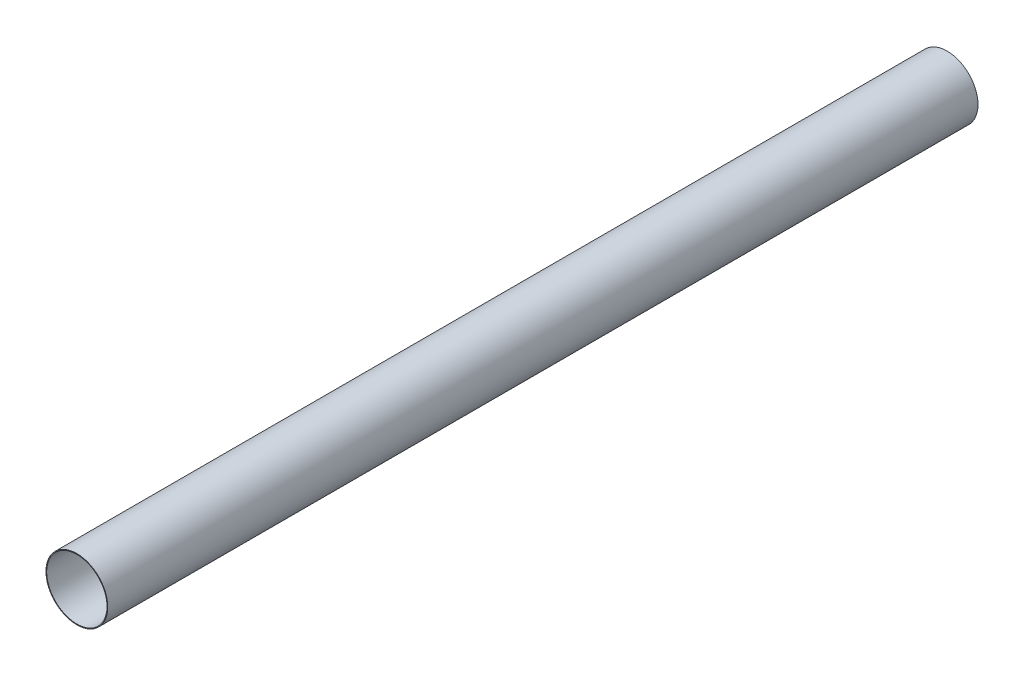
ISO-10303-21;
HEADER;
FILE_DESCRIPTION(('STEP AP214'),'2;1');
FILE_NAME('part.step','',(''),(''),'','','');
FILE_SCHEMA(('AUTOMOTIVE_DESIGN { 1 0 10303 214 1 1 1 1 }'));
ENDSEC;
DATA;
#1=APPLICATION_CONTEXT('core data for automotive mechanical design processes');
#2=APPLICATION_PROTOCOL_DEFINITION('international standard','automotive_design',2000,#1);
#3=PRODUCT_CONTEXT('',#1,'mechanical');
#4=PRODUCT('Part','Part','',(#3));
#5=PRODUCT_RELATED_PRODUCT_CATEGORY('part','',(#4));
#6=PRODUCT_DEFINITION_FORMATION('','',#4);
#7=PRODUCT_DEFINITION_CONTEXT('part definition',#1,'design');
#8=PRODUCT_DEFINITION('design','',#6,#7);
#9=PRODUCT_DEFINITION_SHAPE('','',#8);
#10=(LENGTH_UNIT() NAMED_UNIT(*) SI_UNIT(.MILLI.,.METRE.));
#11=(NAMED_UNIT(*) PLANE_ANGLE_UNIT() SI_UNIT($,.RADIAN.));
#12=(NAMED_UNIT(*) SI_UNIT($,.STERADIAN.) SOLID_ANGLE_UNIT());
#13=UNCERTAINTY_MEASURE_WITH_UNIT(LENGTH_MEASURE(1.E-05),#10,'distance_accuracy_value','');
#14=(GEOMETRIC_REPRESENTATION_CONTEXT(3) GLOBAL_UNCERTAINTY_ASSIGNED_CONTEXT((#13)) GLOBAL_UNIT_ASSIGNED_CONTEXT((#10,
#11,#12)) REPRESENTATION_CONTEXT('',''));
#15=CARTESIAN_POINT('',(0.,0.,0.));
#16=DIRECTION('',(0.,0.,1.));
#17=DIRECTION('',(1.,0.,0.));
#18=AXIS2_PLACEMENT_3D('',#15,#16,#17);
#19=CARTESIAN_POINT('',(0.,0.,300.));
#20=DIRECTION('',(0.,0.,1.));
#21=DIRECTION('',(1.,0.,0.));
#22=AXIS2_PLACEMENT_3D('',#19,#20,#21);
#23=PLANE('',#22);
#24=CARTESIAN_POINT('',(0.,0.,300.));
#25=DIRECTION('',(0.,0.,1.));
#26=DIRECTION('',(1.,0.,0.));
#27=AXIS2_PLACEMENT_3D('',#24,#25,#26);
#28=CIRCLE('',#27,21.3);
#29=CARTESIAN_POINT('',(21.3,0.,300.));
#30=VERTEX_POINT('',#29);
#31=EDGE_CURVE('E10',#30,#30,#28,.T.);
#32=ORIENTED_EDGE('',*,*,#31,.T.);
#33=EDGE_LOOP('',(#32));
#34=FACE_BOUND('',#33,.T.);
#35=CARTESIAN_POINT('',(0.,0.,300.));
#36=DIRECTION('',(0.,0.,1.));
#37=DIRECTION('',(1.,0.,0.));
#38=AXIS2_PLACEMENT_3D('',#35,#36,#37);
#39=CIRCLE('',#38,20.8);
#40=CARTESIAN_POINT('',(20.8,0.,300.));
#41=VERTEX_POINT('',#40);
#42=EDGE_CURVE('E42',#41,#41,#39,.T.);
#43=ORIENTED_EDGE('',*,*,#42,.F.);
#44=EDGE_LOOP('',(#43));
#45=FACE_BOUND('',#44,.T.);
#46=ADVANCED_FACE('F31',(#34,#45),#23,.T.);
#47=CARTESIAN_POINT('',(0.,0.,-300.));
#48=DIRECTION('',(0.,0.,1.));
#49=DIRECTION('',(1.,0.,0.));
#50=AXIS2_PLACEMENT_3D('',#47,#48,#49);
#51=PLANE('',#50);
#52=CARTESIAN_POINT('',(0.,0.,-300.));
#53=DIRECTION('',(0.,0.,1.));
#54=DIRECTION('',(1.,0.,0.));
#55=AXIS2_PLACEMENT_3D('',#52,#53,#54);
#56=CIRCLE('',#55,21.3);
#57=CARTESIAN_POINT('',(21.3,0.,-300.));
#58=VERTEX_POINT('',#57);
#59=EDGE_CURVE('E35',#58,#58,#56,.T.);
#60=ORIENTED_EDGE('',*,*,#59,.F.);
#61=EDGE_LOOP('',(#60));
#62=FACE_BOUND('',#61,.T.);
#63=CARTESIAN_POINT('',(0.,0.,-300.));
#64=DIRECTION('',(0.,0.,1.));
#65=DIRECTION('',(1.,0.,0.));
#66=AXIS2_PLACEMENT_3D('',#63,#64,#65);
#67=CIRCLE('',#66,20.8);
#68=CARTESIAN_POINT('',(20.8,0.,-300.));
#69=VERTEX_POINT('',#68);
#70=EDGE_CURVE('E44',#69,#69,#67,.T.);
#71=ORIENTED_EDGE('',*,*,#70,.T.);
#72=EDGE_LOOP('',(#71));
#73=FACE_BOUND('',#72,.T.);
#74=ADVANCED_FACE('F54',(#62,#73),#51,.F.);
#75=CARTESIAN_POINT('',(0.,0.,300.));
#76=DIRECTION('',(0.,0.,-1.));
#77=DIRECTION('',(-1.,0.,0.));
#78=AXIS2_PLACEMENT_3D('',#75,#76,#77);
#79=CYLINDRICAL_SURFACE('',#78,21.3);
#80=ORIENTED_EDGE('',*,*,#31,.F.);
#81=EDGE_LOOP('',(#80));
#82=FACE_BOUND('',#81,.T.);
#83=ORIENTED_EDGE('',*,*,#59,.T.);
#84=EDGE_LOOP('',(#83));
#85=FACE_BOUND('',#84,.T.);
#86=ADVANCED_FACE('F33',(#82,#85),#79,.T.);
#87=CARTESIAN_POINT('',(0.,0.,300.));
#88=DIRECTION('',(0.,0.,-1.));
#89=DIRECTION('',(-1.,0.,0.));
#90=AXIS2_PLACEMENT_3D('',#87,#88,#89);
#91=CYLINDRICAL_SURFACE('',#90,20.8);
#92=ORIENTED_EDGE('',*,*,#42,.T.);
#93=EDGE_LOOP('',(#92));
#94=FACE_BOUND('',#93,.T.);
#95=ORIENTED_EDGE('',*,*,#70,.F.);
#96=EDGE_LOOP('',(#95));
#97=FACE_BOUND('',#96,.T.);
#98=ADVANCED_FACE('F50',(#94,#97),#91,.F.);
#99=CLOSED_SHELL('',(#46,#74,#86,#98));
#100=MANIFOLD_SOLID_BREP('B2',#99);
#101=ADVANCED_BREP_SHAPE_REPRESENTATION('',(#18,#100),#14);
#102=SHAPE_DEFINITION_REPRESENTATION(#9,#101);
ENDSEC;
END-ISO-10303-21;
